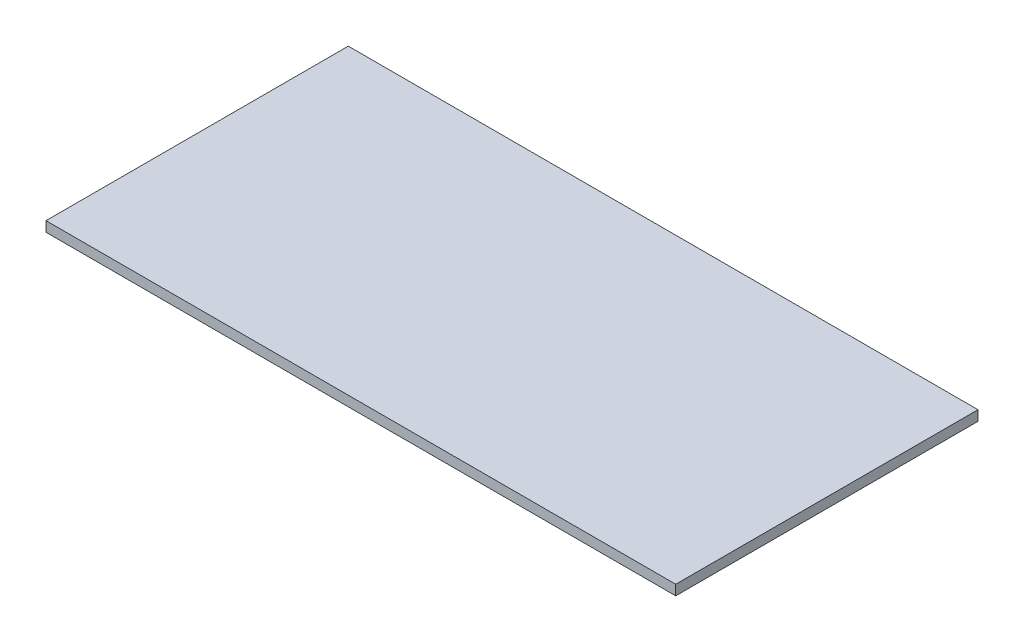
ISO-10303-21;
HEADER;
FILE_DESCRIPTION(('STEP AP214'),'2;1');
FILE_NAME('part.step','',(''),(''),'','','');
FILE_SCHEMA(('AUTOMOTIVE_DESIGN { 1 0 10303 214 1 1 1 1 }'));
ENDSEC;
DATA;
#1=APPLICATION_CONTEXT('core data for automotive mechanical design processes');
#2=APPLICATION_PROTOCOL_DEFINITION('international standard','automotive_design',2000,#1);
#3=PRODUCT_CONTEXT('',#1,'mechanical');
#4=PRODUCT('Part','Part','',(#3));
#5=PRODUCT_RELATED_PRODUCT_CATEGORY('part','',(#4));
#6=PRODUCT_DEFINITION_FORMATION('','',#4);
#7=PRODUCT_DEFINITION_CONTEXT('part definition',#1,'design');
#8=PRODUCT_DEFINITION('design','',#6,#7);
#9=PRODUCT_DEFINITION_SHAPE('','',#8);
#10=(LENGTH_UNIT() NAMED_UNIT(*) SI_UNIT(.MILLI.,.METRE.));
#11=(NAMED_UNIT(*) PLANE_ANGLE_UNIT() SI_UNIT($,.RADIAN.));
#12=(NAMED_UNIT(*) SI_UNIT($,.STERADIAN.) SOLID_ANGLE_UNIT());
#13=UNCERTAINTY_MEASURE_WITH_UNIT(LENGTH_MEASURE(1.E-05),#10,'distance_accuracy_value','');
#14=(GEOMETRIC_REPRESENTATION_CONTEXT(3) GLOBAL_UNCERTAINTY_ASSIGNED_CONTEXT((#13)) GLOBAL_UNIT_ASSIGNED_CONTEXT((#10,
#11,#12)) REPRESENTATION_CONTEXT('',''));
#15=CARTESIAN_POINT('',(0.,0.,0.));
#16=DIRECTION('',(0.,0.,1.));
#17=DIRECTION('',(1.,0.,0.));
#18=AXIS2_PLACEMENT_3D('',#15,#16,#17);
#19=CARTESIAN_POINT('',(-625.,20.,300.));
#20=DIRECTION('',(1.,0.,0.));
#21=DIRECTION('',(0.,0.,-1.));
#22=AXIS2_PLACEMENT_3D('',#19,#20,#21);
#23=PLANE('',#22);
#24=DIRECTION('',(0.,0.,1.));
#25=VECTOR('',#24,1.);
#26=CARTESIAN_POINT('',(-625.,0.,300.));
#27=LINE('',#26,#25);
#28=CARTESIAN_POINT('',(-625.,0.,-300.));
#29=VERTEX_POINT('',#28);
#30=CARTESIAN_POINT('',(-625.,0.,300.));
#31=VERTEX_POINT('',#30);
#32=EDGE_CURVE('E189',#29,#31,#27,.T.);
#33=ORIENTED_EDGE('',*,*,#32,.T.);
#34=DIRECTION('',(0.,-1.,0.));
#35=VECTOR('',#34,1.);
#36=CARTESIAN_POINT('',(-625.,20.,300.));
#37=LINE('',#36,#35);
#38=CARTESIAN_POINT('',(-625.,20.,300.));
#39=VERTEX_POINT('',#38);
#40=EDGE_CURVE('E11',#39,#31,#37,.T.);
#41=ORIENTED_EDGE('',*,*,#40,.F.);
#42=DIRECTION('',(0.,0.,1.));
#43=VECTOR('',#42,1.);
#44=CARTESIAN_POINT('',(-625.,20.,300.));
#45=LINE('',#44,#43);
#46=CARTESIAN_POINT('',(-625.,20.,-300.));
#47=VERTEX_POINT('',#46);
#48=EDGE_CURVE('E195',#47,#39,#45,.T.);
#49=ORIENTED_EDGE('',*,*,#48,.F.);
#50=DIRECTION('',(0.,-1.,0.));
#51=VECTOR('',#50,1.);
#52=CARTESIAN_POINT('',(-625.,20.,-300.));
#53=LINE('',#52,#51);
#54=EDGE_CURVE('E205',#47,#29,#53,.T.);
#55=ORIENTED_EDGE('',*,*,#54,.T.);
#56=EDGE_LOOP('',(#33,#41,#49,#55));
#57=FACE_BOUND('',#56,.T.);
#58=ADVANCED_FACE('F35',(#57),#23,.F.);
#59=CARTESIAN_POINT('',(625.,20.,300.));
#60=DIRECTION('',(0.,0.,-1.));
#61=DIRECTION('',(-1.,0.,0.));
#62=AXIS2_PLACEMENT_3D('',#59,#60,#61);
#63=PLANE('',#62);
#64=DIRECTION('',(1.,0.,0.));
#65=VECTOR('',#64,1.);
#66=CARTESIAN_POINT('',(625.,0.,300.));
#67=LINE('',#66,#65);
#68=CARTESIAN_POINT('',(625.,0.,300.));
#69=VERTEX_POINT('',#68);
#70=EDGE_CURVE('E208',#31,#69,#67,.T.);
#71=ORIENTED_EDGE('',*,*,#70,.T.);
#72=DIRECTION('',(0.,-1.,0.));
#73=VECTOR('',#72,1.);
#74=CARTESIAN_POINT('',(625.,20.,300.));
#75=LINE('',#74,#73);
#76=CARTESIAN_POINT('',(625.,20.,300.));
#77=VERTEX_POINT('',#76);
#78=EDGE_CURVE('E42',#77,#69,#75,.T.);
#79=ORIENTED_EDGE('',*,*,#78,.F.);
#80=DIRECTION('',(1.,0.,0.));
#81=VECTOR('',#80,1.);
#82=CARTESIAN_POINT('',(625.,20.,300.));
#83=LINE('',#82,#81);
#84=EDGE_CURVE('E198',#39,#77,#83,.T.);
#85=ORIENTED_EDGE('',*,*,#84,.F.);
#86=ORIENTED_EDGE('',*,*,#40,.T.);
#87=EDGE_LOOP('',(#71,#79,#85,#86));
#88=FACE_BOUND('',#87,.T.);
#89=ADVANCED_FACE('F238',(#88),#63,.F.);
#90=CARTESIAN_POINT('',(625.,20.,300.));
#91=DIRECTION('',(-1.,0.,0.));
#92=DIRECTION('',(0.,0.,1.));
#93=AXIS2_PLACEMENT_3D('',#90,#91,#92);
#94=PLANE('',#93);
#95=DIRECTION('',(0.,0.,-1.));
#96=VECTOR('',#95,1.);
#97=CARTESIAN_POINT('',(625.,0.,300.));
#98=LINE('',#97,#96);
#99=CARTESIAN_POINT('',(625.,0.,-300.));
#100=VERTEX_POINT('',#99);
#101=EDGE_CURVE('E210',#69,#100,#98,.T.);
#102=ORIENTED_EDGE('',*,*,#101,.T.);
#103=DIRECTION('',(0.,-1.,0.));
#104=VECTOR('',#103,1.);
#105=CARTESIAN_POINT('',(625.,20.,-300.));
#106=LINE('',#105,#104);
#107=CARTESIAN_POINT('',(625.,20.,-300.));
#108=VERTEX_POINT('',#107);
#109=EDGE_CURVE('E215',#108,#100,#106,.T.);
#110=ORIENTED_EDGE('',*,*,#109,.F.);
#111=DIRECTION('',(0.,0.,-1.));
#112=VECTOR('',#111,1.);
#113=CARTESIAN_POINT('',(625.,20.,300.));
#114=LINE('',#113,#112);
#115=EDGE_CURVE('E201',#77,#108,#114,.T.);
#116=ORIENTED_EDGE('',*,*,#115,.F.);
#117=ORIENTED_EDGE('',*,*,#78,.T.);
#118=EDGE_LOOP('',(#102,#110,#116,#117));
#119=FACE_BOUND('',#118,.T.);
#120=ADVANCED_FACE('F222',(#119),#94,.F.);
#121=CARTESIAN_POINT('',(625.,20.,-300.));
#122=DIRECTION('',(0.,0.,1.));
#123=DIRECTION('',(1.,0.,0.));
#124=AXIS2_PLACEMENT_3D('',#121,#122,#123);
#125=PLANE('',#124);
#126=DIRECTION('',(-1.,0.,0.));
#127=VECTOR('',#126,1.);
#128=CARTESIAN_POINT('',(625.,0.,-300.));
#129=LINE('',#128,#127);
#130=EDGE_CURVE('E199',#100,#29,#129,.T.);
#131=ORIENTED_EDGE('',*,*,#130,.T.);
#132=ORIENTED_EDGE('',*,*,#54,.F.);
#133=DIRECTION('',(-1.,0.,0.));
#134=VECTOR('',#133,1.);
#135=CARTESIAN_POINT('',(625.,20.,-300.));
#136=LINE('',#135,#134);
#137=EDGE_CURVE('E203',#108,#47,#136,.T.);
#138=ORIENTED_EDGE('',*,*,#137,.F.);
#139=ORIENTED_EDGE('',*,*,#109,.T.);
#140=EDGE_LOOP('',(#131,#132,#138,#139));
#141=FACE_BOUND('',#140,.T.);
#142=ADVANCED_FACE('F231',(#141),#125,.F.);
#143=CARTESIAN_POINT('',(0.,20.,0.));
#144=DIRECTION('',(0.,1.,0.));
#145=DIRECTION('',(0.,0.,1.));
#146=AXIS2_PLACEMENT_3D('',#143,#144,#145);
#147=PLANE('',#146);
#148=ORIENTED_EDGE('',*,*,#48,.T.);
#149=ORIENTED_EDGE('',*,*,#84,.T.);
#150=ORIENTED_EDGE('',*,*,#115,.T.);
#151=ORIENTED_EDGE('',*,*,#137,.T.);
#152=EDGE_LOOP('',(#148,#149,#150,#151));
#153=FACE_BOUND('',#152,.T.);
#154=ADVANCED_FACE('F237',(#153),#147,.T.);
#155=CARTESIAN_POINT('',(0.,0.,0.));
#156=DIRECTION('',(0.,1.,0.));
#157=DIRECTION('',(0.,0.,1.));
#158=AXIS2_PLACEMENT_3D('',#155,#156,#157);
#159=PLANE('',#158);
#160=DIRECTION('',(1.,0.,0.));
#161=VECTOR('',#160,1.);
#162=CARTESIAN_POINT('',(565.,0.,-250.));
#163=LINE('',#162,#161);
#164=CARTESIAN_POINT('',(-565.,0.,-250.));
#165=VERTEX_POINT('',#164);
#166=CARTESIAN_POINT('',(565.,0.,-250.));
#167=VERTEX_POINT('',#166);
#168=EDGE_CURVE('E179',#165,#167,#163,.T.);
#169=ORIENTED_EDGE('',*,*,#168,.F.);
#170=DIRECTION('',(0.,0.,-1.));
#171=VECTOR('',#170,1.);
#172=CARTESIAN_POINT('',(-565.,0.,-250.));
#173=LINE('',#172,#171);
#174=CARTESIAN_POINT('',(-565.,0.,250.));
#175=VERTEX_POINT('',#174);
#176=EDGE_CURVE('E49',#175,#165,#173,.T.);
#177=ORIENTED_EDGE('',*,*,#176,.F.);
#178=DIRECTION('',(-1.,0.,0.));
#179=VECTOR('',#178,1.);
#180=CARTESIAN_POINT('',(565.,0.,250.));
#181=LINE('',#180,#179);
#182=CARTESIAN_POINT('',(565.,0.,250.));
#183=VERTEX_POINT('',#182);
#184=EDGE_CURVE('E168',#183,#175,#181,.T.);
#185=ORIENTED_EDGE('',*,*,#184,.F.);
#186=DIRECTION('',(0.,0.,1.));
#187=VECTOR('',#186,1.);
#188=CARTESIAN_POINT('',(565.,0.,-250.));
#189=LINE('',#188,#187);
#190=EDGE_CURVE('E182',#167,#183,#189,.T.);
#191=ORIENTED_EDGE('',*,*,#190,.F.);
#192=EDGE_LOOP('',(#169,#177,#185,#191));
#193=FACE_BOUND('',#192,.T.);
#194=ORIENTED_EDGE('',*,*,#32,.F.);
#195=ORIENTED_EDGE('',*,*,#130,.F.);
#196=ORIENTED_EDGE('',*,*,#101,.F.);
#197=ORIENTED_EDGE('',*,*,#70,.F.);
#198=EDGE_LOOP('',(#194,#195,#196,#197));
#199=FACE_BOUND('',#198,.T.);
#200=ADVANCED_FACE('F228',(#193,#199),#159,.F.);
#201=CARTESIAN_POINT('',(-565.,1.,-250.));
#202=DIRECTION('',(-1.,0.,0.));
#203=DIRECTION('',(0.,0.,1.));
#204=AXIS2_PLACEMENT_3D('',#201,#202,#203);
#205=PLANE('',#204);
#206=ORIENTED_EDGE('',*,*,#176,.T.);
#207=DIRECTION('',(0.,-1.,0.));
#208=VECTOR('',#207,1.);
#209=CARTESIAN_POINT('',(-565.,1.,-250.));
#210=LINE('',#209,#208);
#211=CARTESIAN_POINT('',(-565.,1.,-250.));
#212=VERTEX_POINT('',#211);
#213=EDGE_CURVE('E177',#212,#165,#210,.T.);
#214=ORIENTED_EDGE('',*,*,#213,.F.);
#215=DIRECTION('',(0.,0.,-1.));
#216=VECTOR('',#215,1.);
#217=CARTESIAN_POINT('',(-565.,1.,-250.));
#218=LINE('',#217,#216);
#219=CARTESIAN_POINT('',(-565.,1.,250.));
#220=VERTEX_POINT('',#219);
#221=EDGE_CURVE('E164',#220,#212,#218,.T.);
#222=ORIENTED_EDGE('',*,*,#221,.F.);
#223=DIRECTION('',(0.,-1.,0.));
#224=VECTOR('',#223,1.);
#225=CARTESIAN_POINT('',(-565.,1.,250.));
#226=LINE('',#225,#224);
#227=EDGE_CURVE('E187',#220,#175,#226,.T.);
#228=ORIENTED_EDGE('',*,*,#227,.T.);
#229=EDGE_LOOP('',(#206,#214,#222,#228));
#230=FACE_BOUND('',#229,.T.);
#231=ADVANCED_FACE('F250',(#230),#205,.F.);
#232=CARTESIAN_POINT('',(565.,1.,250.));
#233=DIRECTION('',(0.,0.,1.));
#234=DIRECTION('',(1.,0.,0.));
#235=AXIS2_PLACEMENT_3D('',#232,#233,#234);
#236=PLANE('',#235);
#237=ORIENTED_EDGE('',*,*,#184,.T.);
#238=ORIENTED_EDGE('',*,*,#227,.F.);
#239=DIRECTION('',(-1.,0.,0.));
#240=VECTOR('',#239,1.);
#241=CARTESIAN_POINT('',(565.,1.,250.));
#242=LINE('',#241,#240);
#243=CARTESIAN_POINT('',(565.,1.,250.));
#244=VERTEX_POINT('',#243);
#245=EDGE_CURVE('E174',#244,#220,#242,.T.);
#246=ORIENTED_EDGE('',*,*,#245,.F.);
#247=DIRECTION('',(0.,-1.,0.));
#248=VECTOR('',#247,1.);
#249=CARTESIAN_POINT('',(565.,1.,250.));
#250=LINE('',#249,#248);
#251=EDGE_CURVE('E190',#244,#183,#250,.T.);
#252=ORIENTED_EDGE('',*,*,#251,.T.);
#253=EDGE_LOOP('',(#237,#238,#246,#252));
#254=FACE_BOUND('',#253,.T.);
#255=ADVANCED_FACE('F257',(#254),#236,.F.);
#256=CARTESIAN_POINT('',(565.,1.,-250.));
#257=DIRECTION('',(1.,0.,0.));
#258=DIRECTION('',(0.,0.,-1.));
#259=AXIS2_PLACEMENT_3D('',#256,#257,#258);
#260=PLANE('',#259);
#261=ORIENTED_EDGE('',*,*,#190,.T.);
#262=ORIENTED_EDGE('',*,*,#251,.F.);
#263=DIRECTION('',(0.,0.,1.));
#264=VECTOR('',#263,1.);
#265=CARTESIAN_POINT('',(565.,1.,-250.));
#266=LINE('',#265,#264);
#267=CARTESIAN_POINT('',(565.,1.,-250.));
#268=VERTEX_POINT('',#267);
#269=EDGE_CURVE('E171',#268,#244,#266,.T.);
#270=ORIENTED_EDGE('',*,*,#269,.F.);
#271=DIRECTION('',(0.,-1.,0.));
#272=VECTOR('',#271,1.);
#273=CARTESIAN_POINT('',(565.,1.,-250.));
#274=LINE('',#273,#272);
#275=EDGE_CURVE('E192',#268,#167,#274,.T.);
#276=ORIENTED_EDGE('',*,*,#275,.T.);
#277=EDGE_LOOP('',(#261,#262,#270,#276));
#278=FACE_BOUND('',#277,.T.);
#279=ADVANCED_FACE('F261',(#278),#260,.F.);
#280=CARTESIAN_POINT('',(565.,1.,-250.));
#281=DIRECTION('',(0.,0.,-1.));
#282=DIRECTION('',(-1.,0.,0.));
#283=AXIS2_PLACEMENT_3D('',#280,#281,#282);
#284=PLANE('',#283);
#285=ORIENTED_EDGE('',*,*,#168,.T.);
#286=ORIENTED_EDGE('',*,*,#275,.F.);
#287=DIRECTION('',(1.,0.,0.));
#288=VECTOR('',#287,1.);
#289=CARTESIAN_POINT('',(565.,1.,-250.));
#290=LINE('',#289,#288);
#291=EDGE_CURVE('E167',#212,#268,#290,.T.);
#292=ORIENTED_EDGE('',*,*,#291,.F.);
#293=ORIENTED_EDGE('',*,*,#213,.T.);
#294=EDGE_LOOP('',(#285,#286,#292,#293));
#295=FACE_BOUND('',#294,.T.);
#296=ADVANCED_FACE('F258',(#295),#284,.F.);
#297=CARTESIAN_POINT('',(0.,1.,0.));
#298=DIRECTION('',(0.,-1.,0.));
#299=DIRECTION('',(0.,0.,-1.));
#300=AXIS2_PLACEMENT_3D('',#297,#298,#299);
#301=PLANE('',#300);
#302=DIRECTION('',(-1.,0.,0.));
#303=VECTOR('',#302,1.);
#304=CARTESIAN_POINT('',(515.,1.,200.));
#305=LINE('',#304,#303);
#306=CARTESIAN_POINT('',(515.,1.,200.));
#307=VERTEX_POINT('',#306);
#308=CARTESIAN_POINT('',(-515.,1.,200.));
#309=VERTEX_POINT('',#308);
#310=EDGE_CURVE('E135',#307,#309,#305,.T.);
#311=ORIENTED_EDGE('',*,*,#310,.F.);
#312=DIRECTION('',(0.,0.,1.));
#313=VECTOR('',#312,1.);
#314=CARTESIAN_POINT('',(515.,1.,-200.));
#315=LINE('',#314,#313);
#316=CARTESIAN_POINT('',(515.,1.,-200.));
#317=VERTEX_POINT('',#316);
#318=EDGE_CURVE('E145',#317,#307,#315,.T.);
#319=ORIENTED_EDGE('',*,*,#318,.F.);
#320=DIRECTION('',(1.,0.,0.));
#321=VECTOR('',#320,1.);
#322=CARTESIAN_POINT('',(515.,1.,-200.));
#323=LINE('',#322,#321);
#324=CARTESIAN_POINT('',(-515.,1.,-200.));
#325=VERTEX_POINT('',#324);
#326=EDGE_CURVE('E127',#325,#317,#323,.T.);
#327=ORIENTED_EDGE('',*,*,#326,.F.);
#328=DIRECTION('',(0.,0.,-1.));
#329=VECTOR('',#328,1.);
#330=CARTESIAN_POINT('',(-515.,1.,-200.));
#331=LINE('',#330,#329);
#332=EDGE_CURVE('E142',#309,#325,#331,.T.);
#333=ORIENTED_EDGE('',*,*,#332,.F.);
#334=EDGE_LOOP('',(#311,#319,#327,#333));
#335=FACE_BOUND('',#334,.T.);
#336=ORIENTED_EDGE('',*,*,#221,.T.);
#337=ORIENTED_EDGE('',*,*,#291,.T.);
#338=ORIENTED_EDGE('',*,*,#269,.T.);
#339=ORIENTED_EDGE('',*,*,#245,.T.);
#340=EDGE_LOOP('',(#336,#337,#338,#339));
#341=FACE_BOUND('',#340,.T.);
#342=ADVANCED_FACE('F140',(#335,#341),#301,.T.);
#343=CARTESIAN_POINT('',(-515.,1.,-200.));
#344=DIRECTION('',(-1.,0.,0.));
#345=DIRECTION('',(0.,0.,1.));
#346=AXIS2_PLACEMENT_3D('',#343,#344,#345);
#347=PLANE('',#346);
#348=DIRECTION('',(0.,0.,-1.));
#349=VECTOR('',#348,1.);
#350=CARTESIAN_POINT('',(-515.,0.,-200.));
#351=LINE('',#350,#349);
#352=CARTESIAN_POINT('',(-515.,0.,200.));
#353=VERTEX_POINT('',#352);
#354=CARTESIAN_POINT('',(-515.,0.,-200.));
#355=VERTEX_POINT('',#354);
#356=EDGE_CURVE('E156',#353,#355,#351,.T.);
#357=ORIENTED_EDGE('',*,*,#356,.F.);
#358=DIRECTION('',(0.,-1.,0.));
#359=VECTOR('',#358,1.);
#360=CARTESIAN_POINT('',(-515.,1.,200.));
#361=LINE('',#360,#359);
#362=EDGE_CURVE('E148',#309,#353,#361,.T.);
#363=ORIENTED_EDGE('',*,*,#362,.F.);
#364=ORIENTED_EDGE('',*,*,#332,.T.);
#365=DIRECTION('',(0.,-1.,0.));
#366=VECTOR('',#365,1.);
#367=CARTESIAN_POINT('',(-515.,1.,-200.));
#368=LINE('',#367,#366);
#369=EDGE_CURVE('E124',#325,#355,#368,.T.);
#370=ORIENTED_EDGE('',*,*,#369,.T.);
#371=EDGE_LOOP('',(#357,#363,#364,#370));
#372=FACE_BOUND('',#371,.T.);
#373=ADVANCED_FACE('F147',(#372),#347,.T.);
#374=CARTESIAN_POINT('',(515.,1.,200.));
#375=DIRECTION('',(0.,0.,1.));
#376=DIRECTION('',(1.,0.,0.));
#377=AXIS2_PLACEMENT_3D('',#374,#375,#376);
#378=PLANE('',#377);
#379=DIRECTION('',(-1.,0.,0.));
#380=VECTOR('',#379,1.);
#381=CARTESIAN_POINT('',(515.,0.,200.));
#382=LINE('',#381,#380);
#383=CARTESIAN_POINT('',(515.,0.,200.));
#384=VERTEX_POINT('',#383);
#385=EDGE_CURVE('E149',#384,#353,#382,.T.);
#386=ORIENTED_EDGE('',*,*,#385,.F.);
#387=DIRECTION('',(0.,-1.,0.));
#388=VECTOR('',#387,1.);
#389=CARTESIAN_POINT('',(515.,1.,200.));
#390=LINE('',#389,#388);
#391=EDGE_CURVE('E161',#307,#384,#390,.T.);
#392=ORIENTED_EDGE('',*,*,#391,.F.);
#393=ORIENTED_EDGE('',*,*,#310,.T.);
#394=ORIENTED_EDGE('',*,*,#362,.T.);
#395=EDGE_LOOP('',(#386,#392,#393,#394));
#396=FACE_BOUND('',#395,.T.);
#397=ADVANCED_FACE('F273',(#396),#378,.T.);
#398=CARTESIAN_POINT('',(515.,1.,-200.));
#399=DIRECTION('',(1.,0.,0.));
#400=DIRECTION('',(0.,0.,-1.));
#401=AXIS2_PLACEMENT_3D('',#398,#399,#400);
#402=PLANE('',#401);
#403=DIRECTION('',(0.,0.,1.));
#404=VECTOR('',#403,1.);
#405=CARTESIAN_POINT('',(515.,0.,-200.));
#406=LINE('',#405,#404);
#407=CARTESIAN_POINT('',(515.,0.,-200.));
#408=VERTEX_POINT('',#407);
#409=EDGE_CURVE('E57',#408,#384,#406,.T.);
#410=ORIENTED_EDGE('',*,*,#409,.F.);
#411=DIRECTION('',(0.,-1.,0.));
#412=VECTOR('',#411,1.);
#413=CARTESIAN_POINT('',(515.,1.,-200.));
#414=LINE('',#413,#412);
#415=EDGE_CURVE('E134',#317,#408,#414,.T.);
#416=ORIENTED_EDGE('',*,*,#415,.F.);
#417=ORIENTED_EDGE('',*,*,#318,.T.);
#418=ORIENTED_EDGE('',*,*,#391,.T.);
#419=EDGE_LOOP('',(#410,#416,#417,#418));
#420=FACE_BOUND('',#419,.T.);
#421=ADVANCED_FACE('F276',(#420),#402,.T.);
#422=CARTESIAN_POINT('',(515.,1.,-200.));
#423=DIRECTION('',(0.,0.,-1.));
#424=DIRECTION('',(-1.,0.,0.));
#425=AXIS2_PLACEMENT_3D('',#422,#423,#424);
#426=PLANE('',#425);
#427=DIRECTION('',(1.,0.,0.));
#428=VECTOR('',#427,1.);
#429=CARTESIAN_POINT('',(515.,0.,-200.));
#430=LINE('',#429,#428);
#431=EDGE_CURVE('E129',#355,#408,#430,.T.);
#432=ORIENTED_EDGE('',*,*,#431,.F.);
#433=ORIENTED_EDGE('',*,*,#369,.F.);
#434=ORIENTED_EDGE('',*,*,#326,.T.);
#435=ORIENTED_EDGE('',*,*,#415,.T.);
#436=EDGE_LOOP('',(#432,#433,#434,#435));
#437=FACE_BOUND('',#436,.T.);
#438=ADVANCED_FACE('F126',(#437),#426,.T.);
#439=ORIENTED_EDGE('',*,*,#356,.T.);
#440=ORIENTED_EDGE('',*,*,#431,.T.);
#441=ORIENTED_EDGE('',*,*,#409,.T.);
#442=ORIENTED_EDGE('',*,*,#385,.T.);
#443=EDGE_LOOP('',(#439,#440,#441,#442));
#444=FACE_BOUND('',#443,.T.);
#445=ADVANCED_FACE('F252',(#444),#159,.F.);
#446=CLOSED_SHELL('',(#58,#89,#120,#142,#154,#200,#231,#255,#279,#296,#342,#373,#397,#421,#438,#445));
#447=MANIFOLD_SOLID_BREP('B2',#446);
#448=ADVANCED_BREP_SHAPE_REPRESENTATION('',(#18,#447),#14);
#449=SHAPE_DEFINITION_REPRESENTATION(#9,#448);
ENDSEC;
END-ISO-10303-21;
